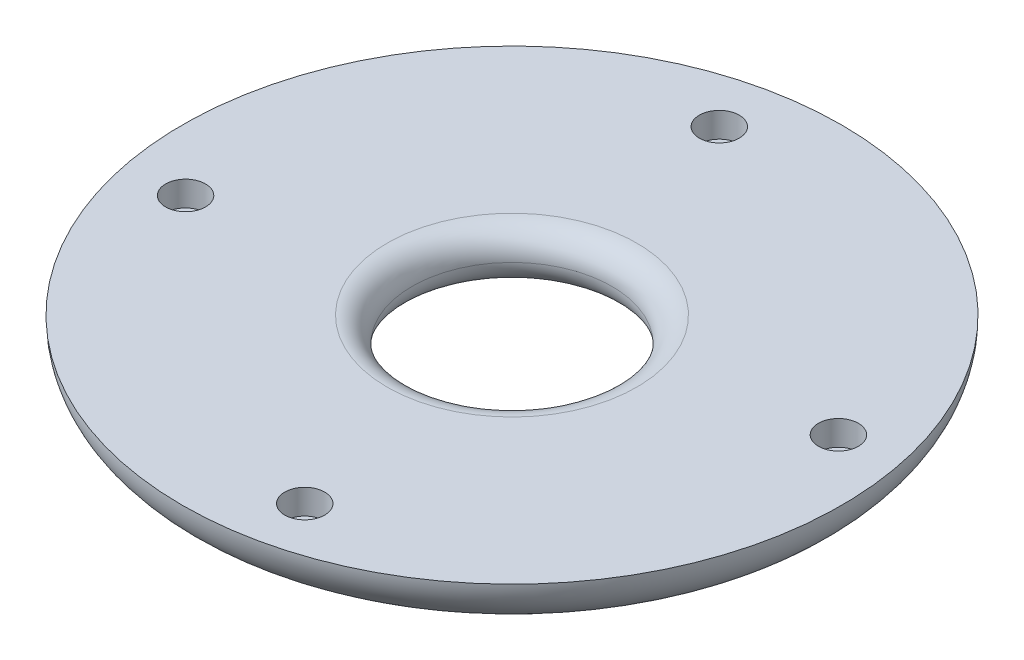
ISO-10303-21;
HEADER;
FILE_DESCRIPTION(('STEP AP214'),'2;1');
FILE_NAME('part.step','',(''),(''),'','','');
FILE_SCHEMA(('AUTOMOTIVE_DESIGN { 1 0 10303 214 1 1 1 1 }'));
ENDSEC;
DATA;
#1=APPLICATION_CONTEXT('core data for automotive mechanical design processes');
#2=APPLICATION_PROTOCOL_DEFINITION('international standard','automotive_design',2000,#1);
#3=PRODUCT_CONTEXT('',#1,'mechanical');
#4=PRODUCT('Part','Part','',(#3));
#5=PRODUCT_RELATED_PRODUCT_CATEGORY('part','',(#4));
#6=PRODUCT_DEFINITION_FORMATION('','',#4);
#7=PRODUCT_DEFINITION_CONTEXT('part definition',#1,'design');
#8=PRODUCT_DEFINITION('design','',#6,#7);
#9=PRODUCT_DEFINITION_SHAPE('','',#8);
#10=(LENGTH_UNIT() NAMED_UNIT(*) SI_UNIT(.MILLI.,.METRE.));
#11=(NAMED_UNIT(*) PLANE_ANGLE_UNIT() SI_UNIT($,.RADIAN.));
#12=(NAMED_UNIT(*) SI_UNIT($,.STERADIAN.) SOLID_ANGLE_UNIT());
#13=UNCERTAINTY_MEASURE_WITH_UNIT(LENGTH_MEASURE(1.E-05),#10,'distance_accuracy_value','');
#14=(GEOMETRIC_REPRESENTATION_CONTEXT(3) GLOBAL_UNCERTAINTY_ASSIGNED_CONTEXT((#13)) GLOBAL_UNIT_ASSIGNED_CONTEXT((#10,
#11,#12)) REPRESENTATION_CONTEXT('',''));
#15=CARTESIAN_POINT('',(0.,0.,0.));
#16=DIRECTION('',(0.,0.,1.));
#17=DIRECTION('',(1.,0.,0.));
#18=AXIS2_PLACEMENT_3D('',#15,#16,#17);
#19=CARTESIAN_POINT('',(0.,0.,0.));
#20=DIRECTION('',(0.,1.,0.));
#21=DIRECTION('',(0.,0.,1.));
#22=AXIS2_PLACEMENT_3D('',#19,#20,#21);
#23=PLANE('',#22);
#24=CARTESIAN_POINT('',(0.,0.,0.));
#25=DIRECTION('',(0.,1.,0.));
#26=DIRECTION('',(0.,0.,1.));
#27=AXIS2_PLACEMENT_3D('',#24,#25,#26);
#28=CIRCLE('',#27,12.5);
#29=CARTESIAN_POINT('',(0.,0.,12.5));
#30=VERTEX_POINT('',#29);
#31=EDGE_CURVE('E13',#30,#30,#28,.T.);
#32=ORIENTED_EDGE('',*,*,#31,.T.);
#33=EDGE_LOOP('',(#32));
#34=FACE_BOUND('',#33,.T.);
#35=DIRECTION('',(0.,0.,1.));
#36=VECTOR('',#35,1.);
#37=CARTESIAN_POINT('',(25.,0.,-2.00000000000017));
#38=LINE('',#37,#36);
#39=CARTESIAN_POINT('',(25.,0.,-2.00000000000017));
#40=VERTEX_POINT('',#39);
#41=CARTESIAN_POINT('',(25.,0.,1.99999999999983));
#42=VERTEX_POINT('',#41);
#43=EDGE_CURVE('E214',#40,#42,#38,.T.);
#44=ORIENTED_EDGE('',*,*,#43,.F.);
#45=DIRECTION('',(1.,0.,0.));
#46=VECTOR('',#45,1.);
#47=CARTESIAN_POINT('',(25.,0.,-2.00000000000017));
#48=LINE('',#47,#46);
#49=CARTESIAN_POINT('',(20.,0.,-2.00000000000014));
#50=VERTEX_POINT('',#49);
#51=EDGE_CURVE('E223',#50,#40,#48,.T.);
#52=ORIENTED_EDGE('',*,*,#51,.F.);
#53=DIRECTION('',(0.,0.,-1.));
#54=VECTOR('',#53,1.);
#55=CARTESIAN_POINT('',(20.,0.,-2.00000000000014));
#56=LINE('',#55,#54);
#57=CARTESIAN_POINT('',(20.,0.,1.99999999999986));
#58=VERTEX_POINT('',#57);
#59=EDGE_CURVE('E220',#58,#50,#56,.T.);
#60=ORIENTED_EDGE('',*,*,#59,.F.);
#61=DIRECTION('',(-1.,0.,0.));
#62=VECTOR('',#61,1.);
#63=CARTESIAN_POINT('',(25.,0.,1.99999999999983));
#64=LINE('',#63,#62);
#65=EDGE_CURVE('E217',#42,#58,#64,.T.);
#66=ORIENTED_EDGE('',*,*,#65,.F.);
#67=EDGE_LOOP('',(#44,#52,#60,#66));
#68=FACE_BOUND('',#67,.T.);
#69=DIRECTION('',(0.,0.,-1.));
#70=VECTOR('',#69,1.);
#71=CARTESIAN_POINT('',(-25.,0.,2.));
#72=LINE('',#71,#70);
#73=CARTESIAN_POINT('',(-25.,0.,2.));
#74=VERTEX_POINT('',#73);
#75=CARTESIAN_POINT('',(-25.,0.,-2.));
#76=VERTEX_POINT('',#75);
#77=EDGE_CURVE('E254',#74,#76,#72,.T.);
#78=ORIENTED_EDGE('',*,*,#77,.F.);
#79=DIRECTION('',(-1.,0.,0.));
#80=VECTOR('',#79,1.);
#81=CARTESIAN_POINT('',(-25.,0.,2.));
#82=LINE('',#81,#80);
#83=CARTESIAN_POINT('',(-20.,0.,2.));
#84=VERTEX_POINT('',#83);
#85=EDGE_CURVE('E263',#84,#74,#82,.T.);
#86=ORIENTED_EDGE('',*,*,#85,.F.);
#87=DIRECTION('',(0.,0.,1.));
#88=VECTOR('',#87,1.);
#89=CARTESIAN_POINT('',(-20.,0.,2.));
#90=LINE('',#89,#88);
#91=CARTESIAN_POINT('',(-20.,0.,-2.));
#92=VERTEX_POINT('',#91);
#93=EDGE_CURVE('E260',#92,#84,#90,.T.);
#94=ORIENTED_EDGE('',*,*,#93,.F.);
#95=DIRECTION('',(1.,0.,0.));
#96=VECTOR('',#95,1.);
#97=CARTESIAN_POINT('',(-25.,0.,-2.));
#98=LINE('',#97,#96);
#99=EDGE_CURVE('E257',#76,#92,#98,.T.);
#100=ORIENTED_EDGE('',*,*,#99,.F.);
#101=EDGE_LOOP('',(#78,#86,#94,#100));
#102=FACE_BOUND('',#101,.T.);
#103=CARTESIAN_POINT('',(0.,0.,0.));
#104=DIRECTION('',(0.,1.,0.));
#105=DIRECTION('',(0.,0.,1.));
#106=AXIS2_PLACEMENT_3D('',#103,#104,#105);
#107=CIRCLE('',#106,28.);
#108=CARTESIAN_POINT('',(0.,0.,28.));
#109=VERTEX_POINT('',#108);
#110=EDGE_CURVE('E301',#109,#109,#107,.F.);
#111=ORIENTED_EDGE('',*,*,#110,.T.);
#112=EDGE_LOOP('',(#111));
#113=FACE_BOUND('',#112,.T.);
#114=DIRECTION('',(-1.,0.,0.));
#115=VECTOR('',#114,1.);
#116=CARTESIAN_POINT('',(2.00000000000009,0.,25.));
#117=LINE('',#116,#115);
#118=CARTESIAN_POINT('',(2.00000000000009,0.,25.));
#119=VERTEX_POINT('',#118);
#120=CARTESIAN_POINT('',(-1.99999999999991,0.,25.));
#121=VERTEX_POINT('',#120);
#122=EDGE_CURVE('E234',#119,#121,#117,.T.);
#123=ORIENTED_EDGE('',*,*,#122,.F.);
#124=DIRECTION('',(0.,0.,1.));
#125=VECTOR('',#124,1.);
#126=CARTESIAN_POINT('',(2.00000000000009,0.,25.));
#127=LINE('',#126,#125);
#128=CARTESIAN_POINT('',(2.00000000000007,0.,20.));
#129=VERTEX_POINT('',#128);
#130=EDGE_CURVE('E243',#129,#119,#127,.T.);
#131=ORIENTED_EDGE('',*,*,#130,.F.);
#132=DIRECTION('',(1.,0.,0.));
#133=VECTOR('',#132,1.);
#134=CARTESIAN_POINT('',(2.00000000000007,0.,20.));
#135=LINE('',#134,#133);
#136=CARTESIAN_POINT('',(-1.99999999999993,0.,20.));
#137=VERTEX_POINT('',#136);
#138=EDGE_CURVE('E240',#137,#129,#135,.T.);
#139=ORIENTED_EDGE('',*,*,#138,.F.);
#140=DIRECTION('',(0.,0.,-1.));
#141=VECTOR('',#140,1.);
#142=CARTESIAN_POINT('',(-1.99999999999991,0.,25.));
#143=LINE('',#142,#141);
#144=EDGE_CURVE('E237',#121,#137,#143,.T.);
#145=ORIENTED_EDGE('',*,*,#144,.F.);
#146=EDGE_LOOP('',(#123,#131,#139,#145));
#147=FACE_BOUND('',#146,.T.);
#148=DIRECTION('',(1.,0.,0.));
#149=VECTOR('',#148,1.);
#150=CARTESIAN_POINT('',(-2.00000000000027,0.,-25.));
#151=LINE('',#150,#149);
#152=CARTESIAN_POINT('',(-2.00000000000027,0.,-25.));
#153=VERTEX_POINT('',#152);
#154=CARTESIAN_POINT('',(1.99999999999973,0.,-25.));
#155=VERTEX_POINT('',#154);
#156=EDGE_CURVE('E184',#153,#155,#151,.T.);
#157=ORIENTED_EDGE('',*,*,#156,.F.);
#158=DIRECTION('',(0.,0.,-1.));
#159=VECTOR('',#158,1.);
#160=CARTESIAN_POINT('',(-2.00000000000027,0.,-25.));
#161=LINE('',#160,#159);
#162=CARTESIAN_POINT('',(-2.00000000000021,0.,-20.));
#163=VERTEX_POINT('',#162);
#164=EDGE_CURVE('E191',#163,#153,#161,.T.);
#165=ORIENTED_EDGE('',*,*,#164,.F.);
#166=DIRECTION('',(-1.,0.,0.));
#167=VECTOR('',#166,1.);
#168=CARTESIAN_POINT('',(-2.00000000000021,0.,-20.));
#169=LINE('',#168,#167);
#170=CARTESIAN_POINT('',(1.99999999999979,0.,-20.));
#171=VERTEX_POINT('',#170);
#172=EDGE_CURVE('E204',#171,#163,#169,.T.);
#173=ORIENTED_EDGE('',*,*,#172,.F.);
#174=DIRECTION('',(0.,0.,1.));
#175=VECTOR('',#174,1.);
#176=CARTESIAN_POINT('',(1.99999999999973,0.,-25.));
#177=LINE('',#176,#175);
#178=EDGE_CURVE('E199',#155,#171,#177,.T.);
#179=ORIENTED_EDGE('',*,*,#178,.F.);
#180=EDGE_LOOP('',(#157,#165,#173,#179));
#181=FACE_BOUND('',#180,.T.);
#182=ADVANCED_FACE('F44',(#34,#68,#102,#113,#147,#181),#23,.F.);
#183=CARTESIAN_POINT('',(0.,5.,0.));
#184=DIRECTION('',(0.,1.,0.));
#185=DIRECTION('',(0.,0.,1.));
#186=AXIS2_PLACEMENT_3D('',#183,#184,#185);
#187=PLANE('',#186);
#188=CARTESIAN_POINT('',(0.,5.,0.));
#189=DIRECTION('',(0.,1.,0.));
#190=DIRECTION('',(0.,0.,1.));
#191=AXIS2_PLACEMENT_3D('',#188,#189,#190);
#192=CIRCLE('',#191,12.5);
#193=CARTESIAN_POINT('',(0.,5.,12.5));
#194=VERTEX_POINT('',#193);
#195=EDGE_CURVE('E53',#194,#194,#192,.F.);
#196=ORIENTED_EDGE('',*,*,#195,.T.);
#197=EDGE_LOOP('',(#196));
#198=FACE_BOUND('',#197,.T.);
#199=CARTESIAN_POINT('',(-5.96537627086481,5.,-26.7199553279625));
#200=DIRECTION('',(0.,1.,0.));
#201=DIRECTION('',(0.,0.,1.));
#202=AXIS2_PLACEMENT_3D('',#199,#200,#201);
#203=CIRCLE('',#202,2.);
#204=CARTESIAN_POINT('',(-5.96537627086481,5.,-24.7199553279625));
#205=VERTEX_POINT('',#204);
#206=EDGE_CURVE('E279',#205,#205,#203,.T.);
#207=ORIENTED_EDGE('',*,*,#206,.F.);
#208=EDGE_LOOP('',(#207));
#209=FACE_BOUND('',#208,.T.);
#210=CARTESIAN_POINT('',(26.7199553279625,5.,-5.96537627086472));
#211=DIRECTION('',(0.,1.,0.));
#212=DIRECTION('',(0.,0.,1.));
#213=AXIS2_PLACEMENT_3D('',#210,#211,#212);
#214=CIRCLE('',#213,2.);
#215=CARTESIAN_POINT('',(26.7199553279625,5.,-3.96537627086472));
#216=VERTEX_POINT('',#215);
#217=EDGE_CURVE('E285',#216,#216,#214,.T.);
#218=ORIENTED_EDGE('',*,*,#217,.F.);
#219=EDGE_LOOP('',(#218));
#220=FACE_BOUND('',#219,.T.);
#221=CARTESIAN_POINT('',(5.96537627086463,5.,26.7199553279625));
#222=DIRECTION('',(0.,1.,0.));
#223=DIRECTION('',(0.,0.,1.));
#224=AXIS2_PLACEMENT_3D('',#221,#222,#223);
#225=CIRCLE('',#224,2.);
#226=CARTESIAN_POINT('',(5.96537627086463,5.,28.7199553279625));
#227=VERTEX_POINT('',#226);
#228=EDGE_CURVE('E274',#227,#227,#225,.T.);
#229=ORIENTED_EDGE('',*,*,#228,.F.);
#230=EDGE_LOOP('',(#229));
#231=FACE_BOUND('',#230,.T.);
#232=CARTESIAN_POINT('',(-26.7199553279625,5.,5.96537627086491));
#233=DIRECTION('',(0.,1.,0.));
#234=DIRECTION('',(0.,0.,1.));
#235=AXIS2_PLACEMENT_3D('',#232,#233,#234);
#236=CIRCLE('',#235,2.);
#237=CARTESIAN_POINT('',(-26.7199553279625,5.,7.96537627086491));
#238=VERTEX_POINT('',#237);
#239=EDGE_CURVE('E278',#238,#238,#236,.T.);
#240=ORIENTED_EDGE('',*,*,#239,.F.);
#241=EDGE_LOOP('',(#240));
#242=FACE_BOUND('',#241,.T.);
#243=CARTESIAN_POINT('',(0.,5.,0.));
#244=DIRECTION('',(0.,1.,0.));
#245=DIRECTION('',(0.,0.,1.));
#246=AXIS2_PLACEMENT_3D('',#243,#244,#245);
#247=CIRCLE('',#246,33.);
#248=CARTESIAN_POINT('',(0.,5.,33.));
#249=VERTEX_POINT('',#248);
#250=EDGE_CURVE('E296',#249,#249,#247,.T.);
#251=ORIENTED_EDGE('',*,*,#250,.T.);
#252=EDGE_LOOP('',(#251));
#253=FACE_BOUND('',#252,.T.);
#254=ADVANCED_FACE('F376',(#198,#209,#220,#231,#242,#253),#187,.T.);
#255=CARTESIAN_POINT('',(-26.7199553279625,2.5,5.96537627086491));
#256=DIRECTION('',(0.,1.,0.));
#257=DIRECTION('',(0.,0.,1.));
#258=AXIS2_PLACEMENT_3D('',#255,#256,#257);
#259=CYLINDRICAL_SURFACE('',#258,2.);
#260=CARTESIAN_POINT('',(-26.7199553279625,2.5,5.96537627086491));
#261=DIRECTION('',(0.,1.,0.));
#262=DIRECTION('',(0.,0.,1.));
#263=AXIS2_PLACEMENT_3D('',#260,#261,#262);
#264=CIRCLE('',#263,2.);
#265=CARTESIAN_POINT('',(-26.7199553279625,2.5,7.96537627086491));
#266=VERTEX_POINT('',#265);
#267=EDGE_CURVE('E293',#266,#266,#264,.T.);
#268=ORIENTED_EDGE('',*,*,#267,.F.);
#269=EDGE_LOOP('',(#268));
#270=FACE_BOUND('',#269,.T.);
#271=ORIENTED_EDGE('',*,*,#239,.T.);
#272=EDGE_LOOP('',(#271));
#273=FACE_BOUND('',#272,.T.);
#274=ADVANCED_FACE('F395',(#270,#273),#259,.F.);
#275=CARTESIAN_POINT('',(-26.7199553279625,2.5,5.96537627086491));
#276=DIRECTION('',(0.,1.,0.));
#277=DIRECTION('',(0.,0.,1.));
#278=AXIS2_PLACEMENT_3D('',#275,#276,#277);
#279=PLANE('',#278);
#280=ORIENTED_EDGE('',*,*,#267,.T.);
#281=EDGE_LOOP('',(#280));
#282=FACE_BOUND('',#281,.T.);
#283=ADVANCED_FACE('F498',(#282),#279,.T.);
#284=CARTESIAN_POINT('',(5.96537627086463,2.5,26.7199553279625));
#285=DIRECTION('',(0.,1.,0.));
#286=DIRECTION('',(0.,0.,1.));
#287=AXIS2_PLACEMENT_3D('',#284,#285,#286);
#288=CYLINDRICAL_SURFACE('',#287,2.);
#289=CARTESIAN_POINT('',(5.96537627086463,2.5,26.7199553279625));
#290=DIRECTION('',(0.,1.,0.));
#291=DIRECTION('',(0.,0.,1.));
#292=AXIS2_PLACEMENT_3D('',#289,#290,#291);
#293=CIRCLE('',#292,2.);
#294=CARTESIAN_POINT('',(5.96537627086463,2.5,28.7199553279625));
#295=VERTEX_POINT('',#294);
#296=EDGE_CURVE('E288',#295,#295,#293,.T.);
#297=ORIENTED_EDGE('',*,*,#296,.F.);
#298=EDGE_LOOP('',(#297));
#299=FACE_BOUND('',#298,.T.);
#300=ORIENTED_EDGE('',*,*,#228,.T.);
#301=EDGE_LOOP('',(#300));
#302=FACE_BOUND('',#301,.T.);
#303=ADVANCED_FACE('F494',(#299,#302),#288,.F.);
#304=CARTESIAN_POINT('',(5.96537627086463,2.5,26.7199553279625));
#305=DIRECTION('',(0.,1.,0.));
#306=DIRECTION('',(0.,0.,1.));
#307=AXIS2_PLACEMENT_3D('',#304,#305,#306);
#308=PLANE('',#307);
#309=ORIENTED_EDGE('',*,*,#296,.T.);
#310=EDGE_LOOP('',(#309));
#311=FACE_BOUND('',#310,.T.);
#312=ADVANCED_FACE('F490',(#311),#308,.T.);
#313=CARTESIAN_POINT('',(26.7199553279625,2.5,-5.96537627086472));
#314=DIRECTION('',(0.,1.,0.));
#315=DIRECTION('',(0.,0.,1.));
#316=AXIS2_PLACEMENT_3D('',#313,#314,#315);
#317=CYLINDRICAL_SURFACE('',#316,2.);
#318=CARTESIAN_POINT('',(26.7199553279625,2.5,-5.96537627086472));
#319=DIRECTION('',(0.,1.,0.));
#320=DIRECTION('',(0.,0.,1.));
#321=AXIS2_PLACEMENT_3D('',#318,#319,#320);
#322=CIRCLE('',#321,2.);
#323=CARTESIAN_POINT('',(26.7199553279625,2.5,-3.96537627086472));
#324=VERTEX_POINT('',#323);
#325=EDGE_CURVE('E282',#324,#324,#322,.T.);
#326=ORIENTED_EDGE('',*,*,#325,.F.);
#327=EDGE_LOOP('',(#326));
#328=FACE_BOUND('',#327,.T.);
#329=ORIENTED_EDGE('',*,*,#217,.T.);
#330=EDGE_LOOP('',(#329));
#331=FACE_BOUND('',#330,.T.);
#332=ADVANCED_FACE('F486',(#328,#331),#317,.F.);
#333=CARTESIAN_POINT('',(26.7199553279625,2.5,-5.96537627086472));
#334=DIRECTION('',(0.,1.,0.));
#335=DIRECTION('',(0.,0.,1.));
#336=AXIS2_PLACEMENT_3D('',#333,#334,#335);
#337=PLANE('',#336);
#338=ORIENTED_EDGE('',*,*,#325,.T.);
#339=EDGE_LOOP('',(#338));
#340=FACE_BOUND('',#339,.T.);
#341=ADVANCED_FACE('F482',(#340),#337,.T.);
#342=CARTESIAN_POINT('',(-5.96537627086481,2.5,-26.7199553279625));
#343=DIRECTION('',(0.,1.,0.));
#344=DIRECTION('',(0.,0.,1.));
#345=AXIS2_PLACEMENT_3D('',#342,#343,#344);
#346=CYLINDRICAL_SURFACE('',#345,2.);
#347=CARTESIAN_POINT('',(-5.96537627086481,2.5,-26.7199553279625));
#348=DIRECTION('',(0.,1.,0.));
#349=DIRECTION('',(0.,0.,1.));
#350=AXIS2_PLACEMENT_3D('',#347,#348,#349);
#351=CIRCLE('',#350,2.);
#352=CARTESIAN_POINT('',(-5.96537627086481,2.5,-24.7199553279625));
#353=VERTEX_POINT('',#352);
#354=EDGE_CURVE('E275',#353,#353,#351,.T.);
#355=ORIENTED_EDGE('',*,*,#354,.F.);
#356=EDGE_LOOP('',(#355));
#357=FACE_BOUND('',#356,.T.);
#358=ORIENTED_EDGE('',*,*,#206,.T.);
#359=EDGE_LOOP('',(#358));
#360=FACE_BOUND('',#359,.T.);
#361=ADVANCED_FACE('F478',(#357,#360),#346,.F.);
#362=CARTESIAN_POINT('',(-5.96537627086481,2.5,-26.7199553279625));
#363=DIRECTION('',(0.,1.,0.));
#364=DIRECTION('',(0.,0.,1.));
#365=AXIS2_PLACEMENT_3D('',#362,#363,#364);
#366=PLANE('',#365);
#367=ORIENTED_EDGE('',*,*,#354,.T.);
#368=EDGE_LOOP('',(#367));
#369=FACE_BOUND('',#368,.T.);
#370=ADVANCED_FACE('F404',(#369),#366,.T.);
#371=CARTESIAN_POINT('',(0.,5.,0.));
#372=DIRECTION('',(0.,1.,0.));
#373=DIRECTION('',(0.,0.,1.));
#374=AXIS2_PLACEMENT_3D('',#371,#372,#373);
#375=TOROIDAL_SURFACE('',#374,28.,5.);
#376=ORIENTED_EDGE('',*,*,#110,.F.);
#377=EDGE_LOOP('',(#376));
#378=FACE_BOUND('',#377,.T.);
#379=ORIENTED_EDGE('',*,*,#250,.F.);
#380=EDGE_LOOP('',(#379));
#381=FACE_BOUND('',#380,.T.);
#382=ADVANCED_FACE('F400',(#378,#381),#375,.T.);
#383=CARTESIAN_POINT('',(-25.,-5.,2.));
#384=DIRECTION('',(1.,0.,0.));
#385=DIRECTION('',(0.,0.,-1.));
#386=AXIS2_PLACEMENT_3D('',#383,#384,#385);
#387=PLANE('',#386);
#388=DIRECTION('',(0.,1.,0.));
#389=VECTOR('',#388,1.);
#390=CARTESIAN_POINT('',(-25.,-5.,-2.));
#391=LINE('',#390,#389);
#392=CARTESIAN_POINT('',(-25.,-2.5,-2.));
#393=VERTEX_POINT('',#392);
#394=EDGE_CURVE('E272',#393,#76,#391,.T.);
#395=ORIENTED_EDGE('',*,*,#394,.F.);
#396=DIRECTION('',(0.,0.,-1.));
#397=VECTOR('',#396,1.);
#398=CARTESIAN_POINT('',(-25.,-2.5,2.));
#399=LINE('',#398,#397);
#400=CARTESIAN_POINT('',(-25.,-2.5,2.));
#401=VERTEX_POINT('',#400);
#402=EDGE_CURVE('E346',#393,#401,#399,.F.);
#403=ORIENTED_EDGE('',*,*,#402,.T.);
#404=DIRECTION('',(0.,1.,0.));
#405=VECTOR('',#404,1.);
#406=CARTESIAN_POINT('',(-25.,-5.,2.));
#407=LINE('',#406,#405);
#408=EDGE_CURVE('E266',#401,#74,#407,.T.);
#409=ORIENTED_EDGE('',*,*,#408,.T.);
#410=ORIENTED_EDGE('',*,*,#77,.T.);
#411=EDGE_LOOP('',(#395,#403,#409,#410));
#412=FACE_BOUND('',#411,.T.);
#413=ADVANCED_FACE('F403',(#412),#387,.F.);
#414=CARTESIAN_POINT('',(-25.,-5.,-2.));
#415=DIRECTION('',(0.,0.,1.));
#416=DIRECTION('',(1.,0.,0.));
#417=AXIS2_PLACEMENT_3D('',#414,#415,#416);
#418=PLANE('',#417);
#419=CARTESIAN_POINT('',(-22.5,-2.5,-2.));
#420=DIRECTION('',(0.,0.,-1.));
#421=DIRECTION('',(-1.,0.,0.));
#422=AXIS2_PLACEMENT_3D('',#419,#420,#421);
#423=CIRCLE('',#422,1.);
#424=CARTESIAN_POINT('',(-23.5,-2.5,-2.));
#425=VERTEX_POINT('',#424);
#426=EDGE_CURVE('E367',#425,#425,#423,.T.);
#427=ORIENTED_EDGE('',*,*,#426,.F.);
#428=EDGE_LOOP('',(#427));
#429=FACE_BOUND('',#428,.T.);
#430=CARTESIAN_POINT('',(-22.5,-2.5,-2.));
#431=DIRECTION('',(0.,0.,1.));
#432=DIRECTION('',(1.,0.,0.));
#433=AXIS2_PLACEMENT_3D('',#430,#431,#432);
#434=CIRCLE('',#433,2.5);
#435=CARTESIAN_POINT('',(-20.,-2.5,-2.));
#436=VERTEX_POINT('',#435);
#437=CARTESIAN_POINT('',(-22.5,-5.,-2.));
#438=VERTEX_POINT('',#437);
#439=EDGE_CURVE('E342',#436,#438,#434,.F.);
#440=ORIENTED_EDGE('',*,*,#439,.T.);
#441=CARTESIAN_POINT('',(-22.5,-2.5,-2.));
#442=DIRECTION('',(0.,0.,1.));
#443=DIRECTION('',(1.,0.,0.));
#444=AXIS2_PLACEMENT_3D('',#441,#442,#443);
#445=CIRCLE('',#444,2.5);
#446=EDGE_CURVE('E344',#438,#393,#445,.F.);
#447=ORIENTED_EDGE('',*,*,#446,.T.);
#448=ORIENTED_EDGE('',*,*,#394,.T.);
#449=ORIENTED_EDGE('',*,*,#99,.T.);
#450=DIRECTION('',(0.,1.,0.));
#451=VECTOR('',#450,1.);
#452=CARTESIAN_POINT('',(-20.,-5.,-2.));
#453=LINE('',#452,#451);
#454=EDGE_CURVE('E270',#436,#92,#453,.T.);
#455=ORIENTED_EDGE('',*,*,#454,.F.);
#456=EDGE_LOOP('',(#440,#447,#448,#449,#455));
#457=FACE_BOUND('',#456,.T.);
#458=ADVANCED_FACE('F447',(#429,#457),#418,.F.);
#459=CARTESIAN_POINT('',(-20.,-5.,2.));
#460=DIRECTION('',(-1.,0.,0.));
#461=DIRECTION('',(0.,0.,1.));
#462=AXIS2_PLACEMENT_3D('',#459,#460,#461);
#463=PLANE('',#462);
#464=DIRECTION('',(0.,1.,0.));
#465=VECTOR('',#464,1.);
#466=CARTESIAN_POINT('',(-20.,-5.,2.));
#467=LINE('',#466,#465);
#468=CARTESIAN_POINT('',(-20.,-2.5,2.));
#469=VERTEX_POINT('',#468);
#470=EDGE_CURVE('E268',#469,#84,#467,.T.);
#471=ORIENTED_EDGE('',*,*,#470,.F.);
#472=DIRECTION('',(0.,0.,1.));
#473=VECTOR('',#472,1.);
#474=CARTESIAN_POINT('',(-20.,-2.5,-2.));
#475=LINE('',#474,#473);
#476=EDGE_CURVE('E351',#469,#436,#475,.F.);
#477=ORIENTED_EDGE('',*,*,#476,.T.);
#478=ORIENTED_EDGE('',*,*,#454,.T.);
#479=ORIENTED_EDGE('',*,*,#93,.T.);
#480=EDGE_LOOP('',(#471,#477,#478,#479));
#481=FACE_BOUND('',#480,.T.);
#482=ADVANCED_FACE('F444',(#481),#463,.F.);
#483=CARTESIAN_POINT('',(-25.,-5.,2.));
#484=DIRECTION('',(0.,0.,-1.));
#485=DIRECTION('',(-1.,0.,0.));
#486=AXIS2_PLACEMENT_3D('',#483,#484,#485);
#487=PLANE('',#486);
#488=CARTESIAN_POINT('',(-22.5,-2.5,2.));
#489=DIRECTION('',(0.,0.,-1.));
#490=DIRECTION('',(-1.,0.,0.));
#491=AXIS2_PLACEMENT_3D('',#488,#489,#490);
#492=CIRCLE('',#491,1.);
#493=CARTESIAN_POINT('',(-23.5,-2.5,2.));
#494=VERTEX_POINT('',#493);
#495=EDGE_CURVE('E364',#494,#494,#492,.T.);
#496=ORIENTED_EDGE('',*,*,#495,.T.);
#497=EDGE_LOOP('',(#496));
#498=FACE_BOUND('',#497,.T.);
#499=ORIENTED_EDGE('',*,*,#408,.F.);
#500=CARTESIAN_POINT('',(-22.5,-2.5,2.));
#501=DIRECTION('',(0.,0.,-1.));
#502=DIRECTION('',(-1.,0.,0.));
#503=AXIS2_PLACEMENT_3D('',#500,#501,#502);
#504=CIRCLE('',#503,2.5);
#505=CARTESIAN_POINT('',(-22.5,-5.,2.));
#506=VERTEX_POINT('',#505);
#507=EDGE_CURVE('E65',#401,#506,#504,.F.);
#508=ORIENTED_EDGE('',*,*,#507,.T.);
#509=CARTESIAN_POINT('',(-22.5,-2.5,2.));
#510=DIRECTION('',(0.,0.,-1.));
#511=DIRECTION('',(-1.,0.,0.));
#512=AXIS2_PLACEMENT_3D('',#509,#510,#511);
#513=CIRCLE('',#512,2.5);
#514=EDGE_CURVE('E60',#506,#469,#513,.F.);
#515=ORIENTED_EDGE('',*,*,#514,.T.);
#516=ORIENTED_EDGE('',*,*,#470,.T.);
#517=ORIENTED_EDGE('',*,*,#85,.T.);
#518=EDGE_LOOP('',(#499,#508,#515,#516,#517));
#519=FACE_BOUND('',#518,.T.);
#520=ADVANCED_FACE('F456',(#498,#519),#487,.F.);
#521=CARTESIAN_POINT('',(2.00000000000009,-5.,25.));
#522=DIRECTION('',(0.,0.,-1.));
#523=DIRECTION('',(-1.,0.,0.));
#524=AXIS2_PLACEMENT_3D('',#521,#522,#523);
#525=PLANE('',#524);
#526=DIRECTION('',(0.,1.,0.));
#527=VECTOR('',#526,1.);
#528=CARTESIAN_POINT('',(-1.99999999999991,-5.,25.));
#529=LINE('',#528,#527);
#530=CARTESIAN_POINT('',(-1.99999999999991,-2.5,25.));
#531=VERTEX_POINT('',#530);
#532=EDGE_CURVE('E252',#531,#121,#529,.T.);
#533=ORIENTED_EDGE('',*,*,#532,.F.);
#534=DIRECTION('',(-1.,0.,0.));
#535=VECTOR('',#534,1.);
#536=CARTESIAN_POINT('',(2.00000000000009,-2.5,25.));
#537=LINE('',#536,#535);
#538=CARTESIAN_POINT('',(2.00000000000009,-2.5,25.));
#539=VERTEX_POINT('',#538);
#540=EDGE_CURVE('E315',#531,#539,#537,.F.);
#541=ORIENTED_EDGE('',*,*,#540,.T.);
#542=DIRECTION('',(0.,1.,0.));
#543=VECTOR('',#542,1.);
#544=CARTESIAN_POINT('',(2.00000000000009,-5.,25.));
#545=LINE('',#544,#543);
#546=EDGE_CURVE('E246',#539,#119,#545,.T.);
#547=ORIENTED_EDGE('',*,*,#546,.T.);
#548=ORIENTED_EDGE('',*,*,#122,.T.);
#549=EDGE_LOOP('',(#533,#541,#547,#548));
#550=FACE_BOUND('',#549,.T.);
#551=ADVANCED_FACE('F458',(#550),#525,.F.);
#552=CARTESIAN_POINT('',(-1.99999999999991,-5.,25.));
#553=DIRECTION('',(1.,0.,0.));
#554=DIRECTION('',(0.,0.,-1.));
#555=AXIS2_PLACEMENT_3D('',#552,#553,#554);
#556=PLANE('',#555);
#557=CARTESIAN_POINT('',(-1.99999999999992,-2.5,22.5));
#558=DIRECTION('',(-1.,0.,0.));
#559=DIRECTION('',(0.,0.,1.));
#560=AXIS2_PLACEMENT_3D('',#557,#558,#559);
#561=CIRCLE('',#560,1.);
#562=CARTESIAN_POINT('',(-1.99999999999991,-2.5,23.5));
#563=VERTEX_POINT('',#562);
#564=EDGE_CURVE('E372',#563,#563,#561,.T.);
#565=ORIENTED_EDGE('',*,*,#564,.F.);
#566=EDGE_LOOP('',(#565));
#567=FACE_BOUND('',#566,.T.);
#568=DIRECTION('',(0.,1.,0.));
#569=VECTOR('',#568,1.);
#570=CARTESIAN_POINT('',(-1.99999999999993,-5.,20.));
#571=LINE('',#570,#569);
#572=CARTESIAN_POINT('',(-1.99999999999993,-2.5,20.));
#573=VERTEX_POINT('',#572);
#574=EDGE_CURVE('E250',#573,#137,#571,.T.);
#575=ORIENTED_EDGE('',*,*,#574,.F.);
#576=CARTESIAN_POINT('',(-1.99999999999992,-2.5,22.5));
#577=DIRECTION('',(1.,0.,0.));
#578=DIRECTION('',(0.,0.,-1.));
#579=AXIS2_PLACEMENT_3D('',#576,#577,#578);
#580=CIRCLE('',#579,2.5);
#581=CARTESIAN_POINT('',(-1.99999999999992,-5.,22.5));
#582=VERTEX_POINT('',#581);
#583=EDGE_CURVE('E313',#573,#582,#580,.F.);
#584=ORIENTED_EDGE('',*,*,#583,.T.);
#585=CARTESIAN_POINT('',(-1.99999999999992,-2.5,22.5));
#586=DIRECTION('',(1.,0.,0.));
#587=DIRECTION('',(0.,0.,-1.));
#588=AXIS2_PLACEMENT_3D('',#585,#586,#587);
#589=CIRCLE('',#588,2.5);
#590=EDGE_CURVE('E311',#582,#531,#589,.F.);
#591=ORIENTED_EDGE('',*,*,#590,.T.);
#592=ORIENTED_EDGE('',*,*,#532,.T.);
#593=ORIENTED_EDGE('',*,*,#144,.T.);
#594=EDGE_LOOP('',(#575,#584,#591,#592,#593));
#595=FACE_BOUND('',#594,.T.);
#596=ADVANCED_FACE('F465',(#567,#595),#556,.F.);
#597=CARTESIAN_POINT('',(2.00000000000007,-5.,20.));
#598=DIRECTION('',(0.,0.,1.));
#599=DIRECTION('',(1.,0.,0.));
#600=AXIS2_PLACEMENT_3D('',#597,#598,#599);
#601=PLANE('',#600);
#602=DIRECTION('',(0.,1.,0.));
#603=VECTOR('',#602,1.);
#604=CARTESIAN_POINT('',(2.00000000000007,-5.,20.));
#605=LINE('',#604,#603);
#606=CARTESIAN_POINT('',(2.00000000000007,-2.5,20.));
#607=VERTEX_POINT('',#606);
#608=EDGE_CURVE('E248',#607,#129,#605,.T.);
#609=ORIENTED_EDGE('',*,*,#608,.F.);
#610=DIRECTION('',(1.,0.,0.));
#611=VECTOR('',#610,1.);
#612=CARTESIAN_POINT('',(-1.99999999999993,-2.5,20.));
#613=LINE('',#612,#611);
#614=EDGE_CURVE('E308',#607,#573,#613,.F.);
#615=ORIENTED_EDGE('',*,*,#614,.T.);
#616=ORIENTED_EDGE('',*,*,#574,.T.);
#617=ORIENTED_EDGE('',*,*,#138,.T.);
#618=EDGE_LOOP('',(#609,#615,#616,#617));
#619=FACE_BOUND('',#618,.T.);
#620=ADVANCED_FACE('F574',(#619),#601,.F.);
#621=CARTESIAN_POINT('',(2.00000000000009,-5.,25.));
#622=DIRECTION('',(-1.,0.,0.));
#623=DIRECTION('',(0.,0.,1.));
#624=AXIS2_PLACEMENT_3D('',#621,#622,#623);
#625=PLANE('',#624);
#626=CARTESIAN_POINT('',(2.00000000000008,-2.5,22.5));
#627=DIRECTION('',(-1.,0.,0.));
#628=DIRECTION('',(0.,0.,1.));
#629=AXIS2_PLACEMENT_3D('',#626,#627,#628);
#630=CIRCLE('',#629,1.);
#631=CARTESIAN_POINT('',(2.00000000000009,-2.5,23.5));
#632=VERTEX_POINT('',#631);
#633=EDGE_CURVE('E368',#632,#632,#630,.T.);
#634=ORIENTED_EDGE('',*,*,#633,.T.);
#635=EDGE_LOOP('',(#634));
#636=FACE_BOUND('',#635,.T.);
#637=CARTESIAN_POINT('',(2.00000000000008,-2.5,22.5));
#638=DIRECTION('',(-1.,0.,0.));
#639=DIRECTION('',(0.,0.,1.));
#640=AXIS2_PLACEMENT_3D('',#637,#638,#639);
#641=CIRCLE('',#640,2.5);
#642=CARTESIAN_POINT('',(2.00000000000008,-5.,22.5));
#643=VERTEX_POINT('',#642);
#644=EDGE_CURVE('E304',#539,#643,#641,.F.);
#645=ORIENTED_EDGE('',*,*,#644,.T.);
#646=CARTESIAN_POINT('',(2.00000000000008,-2.5,22.5));
#647=DIRECTION('',(-1.,0.,0.));
#648=DIRECTION('',(0.,0.,1.));
#649=AXIS2_PLACEMENT_3D('',#646,#647,#648);
#650=CIRCLE('',#649,2.5);
#651=EDGE_CURVE('E306',#643,#607,#650,.F.);
#652=ORIENTED_EDGE('',*,*,#651,.T.);
#653=ORIENTED_EDGE('',*,*,#608,.T.);
#654=ORIENTED_EDGE('',*,*,#130,.T.);
#655=ORIENTED_EDGE('',*,*,#546,.F.);
#656=EDGE_LOOP('',(#645,#652,#653,#654,#655));
#657=FACE_BOUND('',#656,.T.);
#658=ADVANCED_FACE('F579',(#636,#657),#625,.F.);
#659=CARTESIAN_POINT('',(25.,-5.,-2.00000000000017));
#660=DIRECTION('',(-1.,0.,0.));
#661=DIRECTION('',(0.,0.,1.));
#662=AXIS2_PLACEMENT_3D('',#659,#660,#661);
#663=PLANE('',#662);
#664=DIRECTION('',(0.,1.,0.));
#665=VECTOR('',#664,1.);
#666=CARTESIAN_POINT('',(25.,-5.,1.99999999999983));
#667=LINE('',#666,#665);
#668=CARTESIAN_POINT('',(25.,-2.5,1.99999999999983));
#669=VERTEX_POINT('',#668);
#670=EDGE_CURVE('E232',#669,#42,#667,.T.);
#671=ORIENTED_EDGE('',*,*,#670,.F.);
#672=DIRECTION('',(0.,0.,1.));
#673=VECTOR('',#672,1.);
#674=CARTESIAN_POINT('',(25.,-2.5,-2.00000000000017));
#675=LINE('',#674,#673);
#676=CARTESIAN_POINT('',(25.,-2.5,-2.00000000000017));
#677=VERTEX_POINT('',#676);
#678=EDGE_CURVE('E321',#669,#677,#675,.F.);
#679=ORIENTED_EDGE('',*,*,#678,.T.);
#680=DIRECTION('',(0.,1.,0.));
#681=VECTOR('',#680,1.);
#682=CARTESIAN_POINT('',(25.,-5.,-2.00000000000017));
#683=LINE('',#682,#681);
#684=EDGE_CURVE('E226',#677,#40,#683,.T.);
#685=ORIENTED_EDGE('',*,*,#684,.T.);
#686=ORIENTED_EDGE('',*,*,#43,.T.);
#687=EDGE_LOOP('',(#671,#679,#685,#686));
#688=FACE_BOUND('',#687,.T.);
#689=ADVANCED_FACE('F587',(#688),#663,.F.);
#690=CARTESIAN_POINT('',(25.,-5.,1.99999999999983));
#691=DIRECTION('',(0.,0.,-1.));
#692=DIRECTION('',(-1.,0.,0.));
#693=AXIS2_PLACEMENT_3D('',#690,#691,#692);
#694=PLANE('',#693);
#695=CARTESIAN_POINT('',(22.3542194488431,-2.5,1.99999999999984));
#696=DIRECTION('',(0.,0.,-1.));
#697=DIRECTION('',(-1.,0.,0.));
#698=AXIS2_PLACEMENT_3D('',#695,#696,#697);
#699=CIRCLE('',#698,1.);
#700=CARTESIAN_POINT('',(21.3542194488431,-2.5,1.99999999999985));
#701=VERTEX_POINT('',#700);
#702=EDGE_CURVE('E803',#701,#701,#699,.T.);
#703=ORIENTED_EDGE('',*,*,#702,.T.);
#704=EDGE_LOOP('',(#703));
#705=FACE_BOUND('',#704,.T.);
#706=CARTESIAN_POINT('',(22.5,-2.5,1.99999999999984));
#707=DIRECTION('',(0.,0.,-1.));
#708=DIRECTION('',(-1.,0.,0.));
#709=AXIS2_PLACEMENT_3D('',#706,#707,#708);
#710=CIRCLE('',#709,2.5);
#711=CARTESIAN_POINT('',(20.,-2.5,1.99999999999986));
#712=VERTEX_POINT('',#711);
#713=CARTESIAN_POINT('',(22.5,-5.,1.99999999999984));
#714=VERTEX_POINT('',#713);
#715=EDGE_CURVE('E317',#712,#714,#710,.F.);
#716=ORIENTED_EDGE('',*,*,#715,.T.);
#717=CARTESIAN_POINT('',(22.5,-2.5,1.99999999999984));
#718=DIRECTION('',(0.,0.,-1.));
#719=DIRECTION('',(-1.,0.,0.));
#720=AXIS2_PLACEMENT_3D('',#717,#718,#719);
#721=CIRCLE('',#720,2.5);
#722=EDGE_CURVE('E319',#714,#669,#721,.F.);
#723=ORIENTED_EDGE('',*,*,#722,.T.);
#724=ORIENTED_EDGE('',*,*,#670,.T.);
#725=ORIENTED_EDGE('',*,*,#65,.T.);
#726=DIRECTION('',(0.,1.,0.));
#727=VECTOR('',#726,1.);
#728=CARTESIAN_POINT('',(20.,-5.,1.99999999999986));
#729=LINE('',#728,#727);
#730=EDGE_CURVE('E230',#712,#58,#729,.T.);
#731=ORIENTED_EDGE('',*,*,#730,.F.);
#732=EDGE_LOOP('',(#716,#723,#724,#725,#731));
#733=FACE_BOUND('',#732,.T.);
#734=ADVANCED_FACE('F592',(#705,#733),#694,.F.);
#735=CARTESIAN_POINT('',(20.,-5.,-2.00000000000014));
#736=DIRECTION('',(1.,0.,0.));
#737=DIRECTION('',(0.,0.,-1.));
#738=AXIS2_PLACEMENT_3D('',#735,#736,#737);
#739=PLANE('',#738);
#740=DIRECTION('',(0.,1.,0.));
#741=VECTOR('',#740,1.);
#742=CARTESIAN_POINT('',(20.,-5.,-2.00000000000014));
#743=LINE('',#742,#741);
#744=CARTESIAN_POINT('',(20.,-2.5,-2.00000000000014));
#745=VERTEX_POINT('',#744);
#746=EDGE_CURVE('E228',#745,#50,#743,.T.);
#747=ORIENTED_EDGE('',*,*,#746,.F.);
#748=DIRECTION('',(0.,0.,-1.));
#749=VECTOR('',#748,1.);
#750=CARTESIAN_POINT('',(20.,-2.5,1.99999999999986));
#751=LINE('',#750,#749);
#752=EDGE_CURVE('E328',#745,#712,#751,.F.);
#753=ORIENTED_EDGE('',*,*,#752,.T.);
#754=ORIENTED_EDGE('',*,*,#730,.T.);
#755=ORIENTED_EDGE('',*,*,#59,.T.);
#756=EDGE_LOOP('',(#747,#753,#754,#755));
#757=FACE_BOUND('',#756,.T.);
#758=ADVANCED_FACE('F600',(#757),#739,.F.);
#759=CARTESIAN_POINT('',(25.,-5.,-2.00000000000017));
#760=DIRECTION('',(0.,0.,1.));
#761=DIRECTION('',(1.,0.,0.));
#762=AXIS2_PLACEMENT_3D('',#759,#760,#761);
#763=PLANE('',#762);
#764=CARTESIAN_POINT('',(22.3542194488431,-2.5,-2.));
#765=DIRECTION('',(0.,0.,-1.));
#766=DIRECTION('',(-1.,0.,0.));
#767=AXIS2_PLACEMENT_3D('',#764,#765,#766);
#768=CIRCLE('',#767,1.);
#769=CARTESIAN_POINT('',(21.3542194488431,-2.5,-2.));
#770=VERTEX_POINT('',#769);
#771=EDGE_CURVE('E371',#770,#770,#768,.T.);
#772=ORIENTED_EDGE('',*,*,#771,.F.);
#773=EDGE_LOOP('',(#772));
#774=FACE_BOUND('',#773,.T.);
#775=ORIENTED_EDGE('',*,*,#684,.F.);
#776=CARTESIAN_POINT('',(22.5,-2.5,-2.00000000000016));
#777=DIRECTION('',(0.,0.,1.));
#778=DIRECTION('',(1.,0.,0.));
#779=AXIS2_PLACEMENT_3D('',#776,#777,#778);
#780=CIRCLE('',#779,2.5);
#781=CARTESIAN_POINT('',(22.5,-5.,-2.00000000000016));
#782=VERTEX_POINT('',#781);
#783=EDGE_CURVE('E326',#677,#782,#780,.F.);
#784=ORIENTED_EDGE('',*,*,#783,.T.);
#785=CARTESIAN_POINT('',(22.5,-2.5,-2.00000000000016));
#786=DIRECTION('',(0.,0.,1.));
#787=DIRECTION('',(1.,0.,0.));
#788=AXIS2_PLACEMENT_3D('',#785,#786,#787);
#789=CIRCLE('',#788,2.5);
#790=EDGE_CURVE('E324',#782,#745,#789,.F.);
#791=ORIENTED_EDGE('',*,*,#790,.T.);
#792=ORIENTED_EDGE('',*,*,#746,.T.);
#793=ORIENTED_EDGE('',*,*,#51,.T.);
#794=EDGE_LOOP('',(#775,#784,#791,#792,#793));
#795=FACE_BOUND('',#794,.T.);
#796=ADVANCED_FACE('F605',(#774,#795),#763,.F.);
#797=CARTESIAN_POINT('',(-2.00000000000027,-5.,-25.));
#798=DIRECTION('',(0.,0.,1.));
#799=DIRECTION('',(1.,0.,0.));
#800=AXIS2_PLACEMENT_3D('',#797,#798,#799);
#801=PLANE('',#800);
#802=DIRECTION('',(0.,1.,0.));
#803=VECTOR('',#802,1.);
#804=CARTESIAN_POINT('',(1.99999999999973,-5.,-25.));
#805=LINE('',#804,#803);
#806=CARTESIAN_POINT('',(1.99999999999973,-2.5,-25.));
#807=VERTEX_POINT('',#806);
#808=EDGE_CURVE('E212',#807,#155,#805,.T.);
#809=ORIENTED_EDGE('',*,*,#808,.F.);
#810=DIRECTION('',(1.,0.,0.));
#811=VECTOR('',#810,1.);
#812=CARTESIAN_POINT('',(-2.00000000000027,-2.5,-25.));
#813=LINE('',#812,#811);
#814=CARTESIAN_POINT('',(-2.00000000000027,-2.5,-25.));
#815=VERTEX_POINT('',#814);
#816=EDGE_CURVE('E186',#807,#815,#813,.F.);
#817=ORIENTED_EDGE('',*,*,#816,.T.);
#818=DIRECTION('',(0.,1.,0.));
#819=VECTOR('',#818,1.);
#820=CARTESIAN_POINT('',(-2.00000000000027,-5.,-25.));
#821=LINE('',#820,#819);
#822=EDGE_CURVE('E180',#815,#153,#821,.T.);
#823=ORIENTED_EDGE('',*,*,#822,.T.);
#824=ORIENTED_EDGE('',*,*,#156,.T.);
#825=EDGE_LOOP('',(#809,#817,#823,#824));
#826=FACE_BOUND('',#825,.T.);
#827=ADVANCED_FACE('F183',(#826),#801,.F.);
#828=CARTESIAN_POINT('',(1.99999999999973,-5.,-25.));
#829=DIRECTION('',(-1.,0.,0.));
#830=DIRECTION('',(0.,0.,1.));
#831=AXIS2_PLACEMENT_3D('',#828,#829,#830);
#832=PLANE('',#831);
#833=CARTESIAN_POINT('',(1.99999999999976,-2.5,-22.5));
#834=DIRECTION('',(-1.,0.,0.));
#835=DIRECTION('',(0.,0.,1.));
#836=AXIS2_PLACEMENT_3D('',#833,#834,#835);
#837=CIRCLE('',#836,1.);
#838=CARTESIAN_POINT('',(1.99999999999977,-2.5,-21.5));
#839=VERTEX_POINT('',#838);
#840=EDGE_CURVE('E794',#839,#839,#837,.T.);
#841=ORIENTED_EDGE('',*,*,#840,.T.);
#842=EDGE_LOOP('',(#841));
#843=FACE_BOUND('',#842,.T.);
#844=DIRECTION('',(0.,1.,0.));
#845=VECTOR('',#844,1.);
#846=CARTESIAN_POINT('',(1.99999999999979,-5.,-20.));
#847=LINE('',#846,#845);
#848=CARTESIAN_POINT('',(1.99999999999979,-2.5,-20.));
#849=VERTEX_POINT('',#848);
#850=EDGE_CURVE('E210',#849,#171,#847,.T.);
#851=ORIENTED_EDGE('',*,*,#850,.F.);
#852=CARTESIAN_POINT('',(1.99999999999976,-2.5,-22.5));
#853=DIRECTION('',(-1.,0.,0.));
#854=DIRECTION('',(0.,0.,1.));
#855=AXIS2_PLACEMENT_3D('',#852,#853,#854);
#856=CIRCLE('',#855,2.5);
#857=CARTESIAN_POINT('',(1.99999999999976,-5.,-22.5));
#858=VERTEX_POINT('',#857);
#859=EDGE_CURVE('E339',#849,#858,#856,.F.);
#860=ORIENTED_EDGE('',*,*,#859,.T.);
#861=CARTESIAN_POINT('',(1.99999999999976,-2.5,-22.5));
#862=DIRECTION('',(-1.,0.,0.));
#863=DIRECTION('',(0.,0.,1.));
#864=AXIS2_PLACEMENT_3D('',#861,#862,#863);
#865=CIRCLE('',#864,2.5);
#866=EDGE_CURVE('E337',#858,#807,#865,.F.);
#867=ORIENTED_EDGE('',*,*,#866,.T.);
#868=ORIENTED_EDGE('',*,*,#808,.T.);
#869=ORIENTED_EDGE('',*,*,#178,.T.);
#870=EDGE_LOOP('',(#851,#860,#867,#868,#869));
#871=FACE_BOUND('',#870,.T.);
#872=ADVANCED_FACE('F617',(#843,#871),#832,.F.);
#873=CARTESIAN_POINT('',(-2.00000000000021,-5.,-20.));
#874=DIRECTION('',(0.,0.,-1.));
#875=DIRECTION('',(-1.,0.,0.));
#876=AXIS2_PLACEMENT_3D('',#873,#874,#875);
#877=PLANE('',#876);
#878=DIRECTION('',(0.,1.,0.));
#879=VECTOR('',#878,1.);
#880=CARTESIAN_POINT('',(-2.00000000000021,-5.,-20.));
#881=LINE('',#880,#879);
#882=CARTESIAN_POINT('',(-2.00000000000021,-2.5,-20.));
#883=VERTEX_POINT('',#882);
#884=EDGE_CURVE('E190',#883,#163,#881,.T.);
#885=ORIENTED_EDGE('',*,*,#884,.F.);
#886=DIRECTION('',(-1.,0.,0.));
#887=VECTOR('',#886,1.);
#888=CARTESIAN_POINT('',(1.99999999999979,-2.5,-20.));
#889=LINE('',#888,#887);
#890=EDGE_CURVE('E334',#883,#849,#889,.F.);
#891=ORIENTED_EDGE('',*,*,#890,.T.);
#892=ORIENTED_EDGE('',*,*,#850,.T.);
#893=ORIENTED_EDGE('',*,*,#172,.T.);
#894=EDGE_LOOP('',(#885,#891,#892,#893));
#895=FACE_BOUND('',#894,.T.);
#896=ADVANCED_FACE('F624',(#895),#877,.F.);
#897=CARTESIAN_POINT('',(-2.00000000000027,-5.,-25.));
#898=DIRECTION('',(1.,0.,0.));
#899=DIRECTION('',(0.,0.,-1.));
#900=AXIS2_PLACEMENT_3D('',#897,#898,#899);
#901=PLANE('',#900);
#902=CARTESIAN_POINT('',(-2.00000000000007,-2.5,-22.5));
#903=DIRECTION('',(-1.,0.,0.));
#904=DIRECTION('',(0.,0.,1.));
#905=AXIS2_PLACEMENT_3D('',#902,#903,#904);
#906=CIRCLE('',#905,1.);
#907=CARTESIAN_POINT('',(-2.00000000000007,-2.5,-21.5));
#908=VERTEX_POINT('',#907);
#909=EDGE_CURVE('E797',#908,#908,#906,.T.);
#910=ORIENTED_EDGE('',*,*,#909,.F.);
#911=EDGE_LOOP('',(#910));
#912=FACE_BOUND('',#911,.T.);
#913=CARTESIAN_POINT('',(-2.00000000000024,-2.5,-22.5));
#914=DIRECTION('',(1.,0.,0.));
#915=DIRECTION('',(0.,0.,-1.));
#916=AXIS2_PLACEMENT_3D('',#913,#914,#915);
#917=CIRCLE('',#916,2.5);
#918=CARTESIAN_POINT('',(-2.00000000000024,-5.,-22.5));
#919=VERTEX_POINT('',#918);
#920=EDGE_CURVE('E330',#815,#919,#917,.F.);
#921=ORIENTED_EDGE('',*,*,#920,.T.);
#922=CARTESIAN_POINT('',(-2.00000000000024,-2.5,-22.5));
#923=DIRECTION('',(1.,0.,0.));
#924=DIRECTION('',(0.,0.,-1.));
#925=AXIS2_PLACEMENT_3D('',#922,#923,#924);
#926=CIRCLE('',#925,2.5);
#927=EDGE_CURVE('E332',#919,#883,#926,.F.);
#928=ORIENTED_EDGE('',*,*,#927,.T.);
#929=ORIENTED_EDGE('',*,*,#884,.T.);
#930=ORIENTED_EDGE('',*,*,#164,.T.);
#931=ORIENTED_EDGE('',*,*,#822,.F.);
#932=EDGE_LOOP('',(#921,#928,#929,#930,#931));
#933=FACE_BOUND('',#932,.T.);
#934=ADVANCED_FACE('F202',(#912,#933),#901,.F.);
#935=CARTESIAN_POINT('',(0.,-2.5,22.5));
#936=DIRECTION('',(1.,0.,0.));
#937=DIRECTION('',(0.,0.,-1.));
#938=AXIS2_PLACEMENT_3D('',#935,#936,#937);
#939=CYLINDRICAL_SURFACE('',#938,2.5);
#940=ORIENTED_EDGE('',*,*,#540,.F.);
#941=ORIENTED_EDGE('',*,*,#590,.F.);
#942=DIRECTION('',(-1.,0.,0.));
#943=VECTOR('',#942,1.);
#944=CARTESIAN_POINT('',(-1.99999999999992,-5.,22.5));
#945=LINE('',#944,#943);
#946=EDGE_CURVE('E200',#643,#582,#945,.T.);
#947=ORIENTED_EDGE('',*,*,#946,.F.);
#948=ORIENTED_EDGE('',*,*,#644,.F.);
#949=EDGE_LOOP('',(#940,#941,#947,#948));
#950=FACE_BOUND('',#949,.T.);
#951=ADVANCED_FACE('F410',(#950),#939,.T.);
#952=CARTESIAN_POINT('',(0.,-2.5,22.5));
#953=DIRECTION('',(-1.,0.,0.));
#954=DIRECTION('',(0.,0.,1.));
#955=AXIS2_PLACEMENT_3D('',#952,#953,#954);
#956=CYLINDRICAL_SURFACE('',#955,2.5);
#957=ORIENTED_EDGE('',*,*,#583,.F.);
#958=ORIENTED_EDGE('',*,*,#614,.F.);
#959=ORIENTED_EDGE('',*,*,#651,.F.);
#960=ORIENTED_EDGE('',*,*,#946,.T.);
#961=EDGE_LOOP('',(#957,#958,#959,#960));
#962=FACE_BOUND('',#961,.T.);
#963=ADVANCED_FACE('F406',(#962),#956,.T.);
#964=CARTESIAN_POINT('',(22.5,-2.5,-1.56125112837913E-13));
#965=DIRECTION('',(0.,0.,1.));
#966=DIRECTION('',(1.,0.,0.));
#967=AXIS2_PLACEMENT_3D('',#964,#965,#966);
#968=CYLINDRICAL_SURFACE('',#967,2.5);
#969=ORIENTED_EDGE('',*,*,#752,.F.);
#970=ORIENTED_EDGE('',*,*,#790,.F.);
#971=DIRECTION('',(0.,0.,-1.));
#972=VECTOR('',#971,1.);
#973=CARTESIAN_POINT('',(22.5,-5.,-2.00000000000016));
#974=LINE('',#973,#972);
#975=EDGE_CURVE('E355',#714,#782,#974,.T.);
#976=ORIENTED_EDGE('',*,*,#975,.F.);
#977=ORIENTED_EDGE('',*,*,#715,.F.);
#978=EDGE_LOOP('',(#969,#970,#976,#977));
#979=FACE_BOUND('',#978,.T.);
#980=ADVANCED_FACE('F409',(#979),#968,.T.);
#981=CARTESIAN_POINT('',(22.5,-2.5,-1.56125112837913E-13));
#982=DIRECTION('',(0.,0.,-1.));
#983=DIRECTION('',(-1.,0.,0.));
#984=AXIS2_PLACEMENT_3D('',#981,#982,#983);
#985=CYLINDRICAL_SURFACE('',#984,2.5);
#986=ORIENTED_EDGE('',*,*,#783,.F.);
#987=ORIENTED_EDGE('',*,*,#678,.F.);
#988=ORIENTED_EDGE('',*,*,#722,.F.);
#989=ORIENTED_EDGE('',*,*,#975,.T.);
#990=EDGE_LOOP('',(#986,#987,#988,#989));
#991=FACE_BOUND('',#990,.T.);
#992=ADVANCED_FACE('F415',(#991),#985,.T.);
#993=CARTESIAN_POINT('',(-2.34187669256869E-13,-2.5,-22.5));
#994=DIRECTION('',(-1.,0.,0.));
#995=DIRECTION('',(0.,0.,1.));
#996=AXIS2_PLACEMENT_3D('',#993,#994,#995);
#997=CYLINDRICAL_SURFACE('',#996,2.5);
#998=ORIENTED_EDGE('',*,*,#816,.F.);
#999=ORIENTED_EDGE('',*,*,#866,.F.);
#1000=DIRECTION('',(1.,0.,0.));
#1001=VECTOR('',#1000,1.);
#1002=CARTESIAN_POINT('',(1.99999999999976,-5.,-22.5));
#1003=LINE('',#1002,#1001);
#1004=EDGE_CURVE('E358',#919,#858,#1003,.T.);
#1005=ORIENTED_EDGE('',*,*,#1004,.F.);
#1006=ORIENTED_EDGE('',*,*,#920,.F.);
#1007=EDGE_LOOP('',(#998,#999,#1005,#1006));
#1008=FACE_BOUND('',#1007,.T.);
#1009=ADVANCED_FACE('F418',(#1008),#997,.T.);
#1010=CARTESIAN_POINT('',(-2.34187669256869E-13,-2.5,-22.5));
#1011=DIRECTION('',(1.,0.,0.));
#1012=DIRECTION('',(0.,0.,-1.));
#1013=AXIS2_PLACEMENT_3D('',#1010,#1011,#1012);
#1014=CYLINDRICAL_SURFACE('',#1013,2.5);
#1015=ORIENTED_EDGE('',*,*,#859,.F.);
#1016=ORIENTED_EDGE('',*,*,#890,.F.);
#1017=ORIENTED_EDGE('',*,*,#927,.F.);
#1018=ORIENTED_EDGE('',*,*,#1004,.T.);
#1019=EDGE_LOOP('',(#1015,#1016,#1017,#1018));
#1020=FACE_BOUND('',#1019,.T.);
#1021=ADVANCED_FACE('F423',(#1020),#1014,.T.);
#1022=CARTESIAN_POINT('',(-22.5,-2.5,0.));
#1023=DIRECTION('',(0.,0.,-1.));
#1024=DIRECTION('',(-1.,0.,0.));
#1025=AXIS2_PLACEMENT_3D('',#1022,#1023,#1024);
#1026=CYLINDRICAL_SURFACE('',#1025,2.5);
#1027=ORIENTED_EDGE('',*,*,#476,.F.);
#1028=ORIENTED_EDGE('',*,*,#514,.F.);
#1029=DIRECTION('',(0.,0.,1.));
#1030=VECTOR('',#1029,1.);
#1031=CARTESIAN_POINT('',(-22.5,-5.,2.));
#1032=LINE('',#1031,#1030);
#1033=EDGE_CURVE('E361',#438,#506,#1032,.T.);
#1034=ORIENTED_EDGE('',*,*,#1033,.F.);
#1035=ORIENTED_EDGE('',*,*,#439,.F.);
#1036=EDGE_LOOP('',(#1027,#1028,#1034,#1035));
#1037=FACE_BOUND('',#1036,.T.);
#1038=ADVANCED_FACE('F426',(#1037),#1026,.T.);
#1039=CARTESIAN_POINT('',(-22.5,-2.5,0.));
#1040=DIRECTION('',(0.,0.,1.));
#1041=DIRECTION('',(1.,0.,0.));
#1042=AXIS2_PLACEMENT_3D('',#1039,#1040,#1041);
#1043=CYLINDRICAL_SURFACE('',#1042,2.5);
#1044=ORIENTED_EDGE('',*,*,#507,.F.);
#1045=ORIENTED_EDGE('',*,*,#402,.F.);
#1046=ORIENTED_EDGE('',*,*,#446,.F.);
#1047=ORIENTED_EDGE('',*,*,#1033,.T.);
#1048=EDGE_LOOP('',(#1044,#1045,#1046,#1047));
#1049=FACE_BOUND('',#1048,.T.);
#1050=ADVANCED_FACE('F431',(#1049),#1043,.T.);
#1051=CARTESIAN_POINT('',(-22.5,-2.5,3.));
#1052=DIRECTION('',(0.,0.,-1.));
#1053=DIRECTION('',(-1.,0.,0.));
#1054=AXIS2_PLACEMENT_3D('',#1051,#1052,#1053);
#1055=CYLINDRICAL_SURFACE('',#1054,1.);
#1056=ORIENTED_EDGE('',*,*,#426,.T.);
#1057=EDGE_LOOP('',(#1056));
#1058=FACE_BOUND('',#1057,.T.);
#1059=ORIENTED_EDGE('',*,*,#495,.F.);
#1060=EDGE_LOOP('',(#1059));
#1061=FACE_BOUND('',#1060,.T.);
#1062=ADVANCED_FACE('F433',(#1058,#1061),#1055,.F.);
#1063=CARTESIAN_POINT('',(22.3542194488431,-2.5,3.));
#1064=DIRECTION('',(0.,0.,-1.));
#1065=DIRECTION('',(-1.,0.,0.));
#1066=AXIS2_PLACEMENT_3D('',#1063,#1064,#1065);
#1067=CYLINDRICAL_SURFACE('',#1066,1.);
#1068=ORIENTED_EDGE('',*,*,#771,.T.);
#1069=EDGE_LOOP('',(#1068));
#1070=FACE_BOUND('',#1069,.T.);
#1071=ORIENTED_EDGE('',*,*,#702,.F.);
#1072=EDGE_LOOP('',(#1071));
#1073=FACE_BOUND('',#1072,.T.);
#1074=ADVANCED_FACE('F685',(#1070,#1073),#1067,.F.);
#1075=CARTESIAN_POINT('',(3.00000000000008,-2.5,22.5));
#1076=DIRECTION('',(-1.,0.,0.));
#1077=DIRECTION('',(0.,0.,1.));
#1078=AXIS2_PLACEMENT_3D('',#1075,#1076,#1077);
#1079=CYLINDRICAL_SURFACE('',#1078,1.);
#1080=ORIENTED_EDGE('',*,*,#564,.T.);
#1081=EDGE_LOOP('',(#1080));
#1082=FACE_BOUND('',#1081,.T.);
#1083=ORIENTED_EDGE('',*,*,#633,.F.);
#1084=EDGE_LOOP('',(#1083));
#1085=FACE_BOUND('',#1084,.T.);
#1086=ADVANCED_FACE('F693',(#1082,#1085),#1079,.F.);
#1087=CARTESIAN_POINT('',(2.99999999999993,-2.5,-22.5));
#1088=DIRECTION('',(-1.,0.,0.));
#1089=DIRECTION('',(0.,0.,1.));
#1090=AXIS2_PLACEMENT_3D('',#1087,#1088,#1089);
#1091=CYLINDRICAL_SURFACE('',#1090,1.);
#1092=ORIENTED_EDGE('',*,*,#909,.T.);
#1093=EDGE_LOOP('',(#1092));
#1094=FACE_BOUND('',#1093,.T.);
#1095=ORIENTED_EDGE('',*,*,#840,.F.);
#1096=EDGE_LOOP('',(#1095));
#1097=FACE_BOUND('',#1096,.T.);
#1098=ADVANCED_FACE('F385',(#1094,#1097),#1091,.F.);
#1099=CARTESIAN_POINT('',(0.,2.5,0.));
#1100=DIRECTION('',(0.,1.,0.));
#1101=DIRECTION('',(0.,0.,1.));
#1102=AXIS2_PLACEMENT_3D('',#1099,#1100,#1101);
#1103=TOROIDAL_SURFACE('',#1102,12.5,2.5);
#1104=ORIENTED_EDGE('',*,*,#31,.F.);
#1105=EDGE_LOOP('',(#1104));
#1106=FACE_BOUND('',#1105,.T.);
#1107=CARTESIAN_POINT('',(0.,2.5,0.));
#1108=DIRECTION('',(0.,1.,0.));
#1109=DIRECTION('',(0.,0.,1.));
#1110=AXIS2_PLACEMENT_3D('',#1107,#1108,#1109);
#1111=CIRCLE('',#1110,10.);
#1112=CARTESIAN_POINT('',(0.,2.5,10.));
#1113=VERTEX_POINT('',#1112);
#1114=EDGE_CURVE('E48',#1113,#1113,#1111,.F.);
#1115=ORIENTED_EDGE('',*,*,#1114,.F.);
#1116=EDGE_LOOP('',(#1115));
#1117=FACE_BOUND('',#1116,.T.);
#1118=ADVANCED_FACE('F46',(#1106,#1117),#1103,.T.);
#1119=CARTESIAN_POINT('',(0.,2.5,0.));
#1120=DIRECTION('',(0.,1.,0.));
#1121=DIRECTION('',(0.,0.,1.));
#1122=AXIS2_PLACEMENT_3D('',#1119,#1120,#1121);
#1123=TOROIDAL_SURFACE('',#1122,12.5,2.5);
#1124=ORIENTED_EDGE('',*,*,#1114,.T.);
#1125=EDGE_LOOP('',(#1124));
#1126=FACE_BOUND('',#1125,.T.);
#1127=ORIENTED_EDGE('',*,*,#195,.F.);
#1128=EDGE_LOOP('',(#1127));
#1129=FACE_BOUND('',#1128,.T.);
#1130=ADVANCED_FACE('F379',(#1126,#1129),#1123,.T.);
#1131=CLOSED_SHELL('',(#182,#254,#274,#283,#303,#312,#332,#341,#361,#370,#382,#413,#458,#482,
#520,#551,#596,#620,#658,#689,#734,#758,#796,#827,#872,#896,#934,#951,#963,#980,#992,#1009,
#1021,#1038,#1050,#1062,#1074,#1086,#1098,#1118,#1130));
#1132=MANIFOLD_SOLID_BREP('B2',#1131);
#1133=ADVANCED_BREP_SHAPE_REPRESENTATION('',(#18,#1132),#14);
#1134=SHAPE_DEFINITION_REPRESENTATION(#9,#1133);
ENDSEC;
END-ISO-10303-21;
